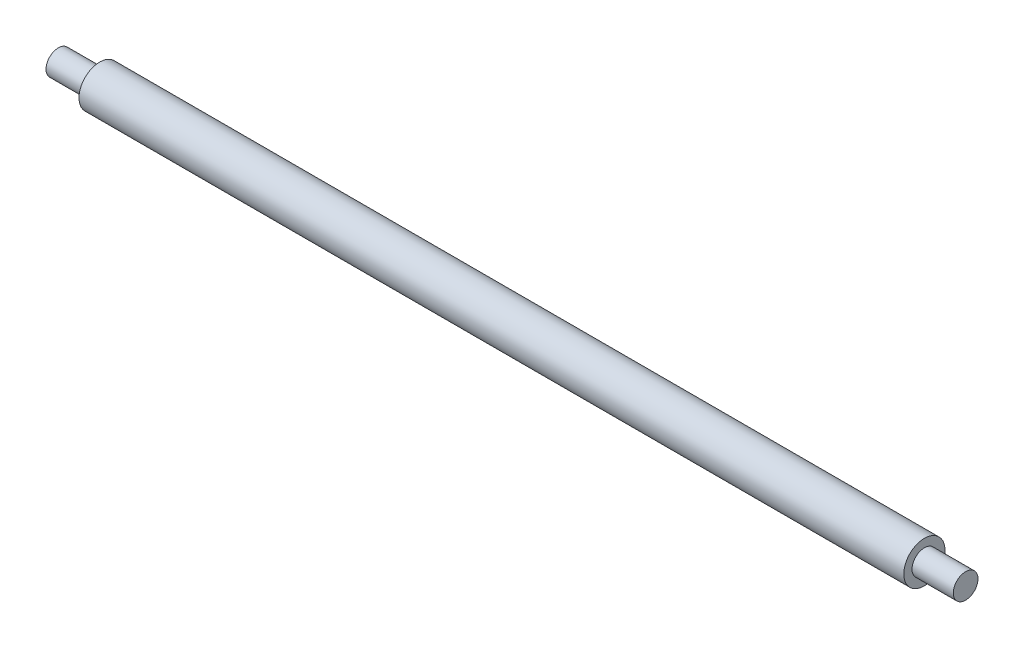
ISO-10303-21;
HEADER;
FILE_DESCRIPTION(('STEP AP214'),'2;1');
FILE_NAME('part.step','',(''),(''),'','','');
FILE_SCHEMA(('AUTOMOTIVE_DESIGN { 1 0 10303 214 1 1 1 1 }'));
ENDSEC;
DATA;
#1=APPLICATION_CONTEXT('core data for automotive mechanical design processes');
#2=APPLICATION_PROTOCOL_DEFINITION('international standard','automotive_design',2000,#1);
#3=PRODUCT_CONTEXT('',#1,'mechanical');
#4=PRODUCT('Part','Part','',(#3));
#5=PRODUCT_RELATED_PRODUCT_CATEGORY('part','',(#4));
#6=PRODUCT_DEFINITION_FORMATION('','',#4);
#7=PRODUCT_DEFINITION_CONTEXT('part definition',#1,'design');
#8=PRODUCT_DEFINITION('design','',#6,#7);
#9=PRODUCT_DEFINITION_SHAPE('','',#8);
#10=(LENGTH_UNIT() NAMED_UNIT(*) SI_UNIT(.MILLI.,.METRE.));
#11=(NAMED_UNIT(*) PLANE_ANGLE_UNIT() SI_UNIT($,.RADIAN.));
#12=(NAMED_UNIT(*) SI_UNIT($,.STERADIAN.) SOLID_ANGLE_UNIT());
#13=UNCERTAINTY_MEASURE_WITH_UNIT(LENGTH_MEASURE(1.E-05),#10,'distance_accuracy_value','');
#14=(GEOMETRIC_REPRESENTATION_CONTEXT(3) GLOBAL_UNCERTAINTY_ASSIGNED_CONTEXT((#13)) GLOBAL_UNIT_ASSIGNED_CONTEXT((#10,
#11,#12)) REPRESENTATION_CONTEXT('',''));
#15=CARTESIAN_POINT('',(0.,0.,0.));
#16=DIRECTION('',(0.,0.,1.));
#17=DIRECTION('',(1.,0.,0.));
#18=AXIS2_PLACEMENT_3D('',#15,#16,#17);
#19=CARTESIAN_POINT('',(220.,0.,0.));
#20=DIRECTION('',(-1.,0.,0.));
#21=DIRECTION('',(0.,0.,1.));
#22=AXIS2_PLACEMENT_3D('',#19,#20,#21);
#23=CYLINDRICAL_SURFACE('',#22,5.);
#24=CARTESIAN_POINT('',(10.,0.,0.));
#25=DIRECTION('',(-1.,0.,0.));
#26=DIRECTION('',(0.,0.,1.));
#27=AXIS2_PLACEMENT_3D('',#24,#25,#26);
#28=CIRCLE('',#27,5.);
#29=CARTESIAN_POINT('',(10.,0.,5.));
#30=VERTEX_POINT('',#29);
#31=EDGE_CURVE('E11',#30,#30,#28,.T.);
#32=ORIENTED_EDGE('',*,*,#31,.F.);
#33=EDGE_LOOP('',(#32));
#34=FACE_BOUND('',#33,.T.);
#35=CARTESIAN_POINT('',(210.,0.,0.));
#36=DIRECTION('',(1.,0.,0.));
#37=DIRECTION('',(0.,0.,-1.));
#38=AXIS2_PLACEMENT_3D('',#35,#36,#37);
#39=CIRCLE('',#38,5.);
#40=CARTESIAN_POINT('',(210.,0.,-5.));
#41=VERTEX_POINT('',#40);
#42=EDGE_CURVE('E39',#41,#41,#39,.T.);
#43=ORIENTED_EDGE('',*,*,#42,.F.);
#44=EDGE_LOOP('',(#43));
#45=FACE_BOUND('',#44,.T.);
#46=ADVANCED_FACE('F36',(#34,#45),#23,.T.);
#47=CARTESIAN_POINT('',(10.,0.,0.));
#48=DIRECTION('',(-1.,0.,0.));
#49=DIRECTION('',(0.,0.,1.));
#50=AXIS2_PLACEMENT_3D('',#47,#48,#49);
#51=PLANE('',#50);
#52=CARTESIAN_POINT('',(10.,0.,0.));
#53=DIRECTION('',(-1.,0.,0.));
#54=DIRECTION('',(0.,0.,1.));
#55=AXIS2_PLACEMENT_3D('',#52,#53,#54);
#56=CIRCLE('',#55,3.);
#57=CARTESIAN_POINT('',(10.,0.,3.));
#58=VERTEX_POINT('',#57);
#59=EDGE_CURVE('E43',#58,#58,#56,.T.);
#60=ORIENTED_EDGE('',*,*,#59,.F.);
#61=EDGE_LOOP('',(#60));
#62=FACE_BOUND('',#61,.T.);
#63=ORIENTED_EDGE('',*,*,#31,.T.);
#64=EDGE_LOOP('',(#63));
#65=FACE_BOUND('',#64,.T.);
#66=ADVANCED_FACE('F65',(#62,#65),#51,.T.);
#67=CARTESIAN_POINT('',(10.,0.,0.));
#68=DIRECTION('',(-1.,0.,0.));
#69=DIRECTION('',(0.,0.,1.));
#70=AXIS2_PLACEMENT_3D('',#67,#68,#69);
#71=CYLINDRICAL_SURFACE('',#70,3.);
#72=ORIENTED_EDGE('',*,*,#59,.T.);
#73=EDGE_LOOP('',(#72));
#74=FACE_BOUND('',#73,.T.);
#75=CARTESIAN_POINT('',(0.,0.,0.));
#76=DIRECTION('',(-1.,0.,0.));
#77=DIRECTION('',(0.,0.,1.));
#78=AXIS2_PLACEMENT_3D('',#75,#76,#77);
#79=CIRCLE('',#78,3.);
#80=CARTESIAN_POINT('',(0.,0.,3.));
#81=VERTEX_POINT('',#80);
#82=EDGE_CURVE('E47',#81,#81,#79,.T.);
#83=ORIENTED_EDGE('',*,*,#82,.F.);
#84=EDGE_LOOP('',(#83));
#85=FACE_BOUND('',#84,.T.);
#86=ADVANCED_FACE('F70',(#74,#85),#71,.T.);
#87=CARTESIAN_POINT('',(0.,0.,0.));
#88=DIRECTION('',(1.,0.,0.));
#89=DIRECTION('',(0.,0.,-1.));
#90=AXIS2_PLACEMENT_3D('',#87,#88,#89);
#91=PLANE('',#90);
#92=ORIENTED_EDGE('',*,*,#82,.T.);
#93=EDGE_LOOP('',(#92));
#94=FACE_BOUND('',#93,.T.);
#95=ADVANCED_FACE('F76',(#94),#91,.F.);
#96=CARTESIAN_POINT('',(210.,0.,0.));
#97=DIRECTION('',(1.,0.,0.));
#98=DIRECTION('',(0.,0.,-1.));
#99=AXIS2_PLACEMENT_3D('',#96,#97,#98);
#100=PLANE('',#99);
#101=CARTESIAN_POINT('',(210.,0.,0.));
#102=DIRECTION('',(1.,0.,0.));
#103=DIRECTION('',(0.,0.,-1.));
#104=AXIS2_PLACEMENT_3D('',#101,#102,#103);
#105=CIRCLE('',#104,3.);
#106=CARTESIAN_POINT('',(210.,0.,-3.));
#107=VERTEX_POINT('',#106);
#108=EDGE_CURVE('E55',#107,#107,#105,.T.);
#109=ORIENTED_EDGE('',*,*,#108,.F.);
#110=EDGE_LOOP('',(#109));
#111=FACE_BOUND('',#110,.T.);
#112=ORIENTED_EDGE('',*,*,#42,.T.);
#113=EDGE_LOOP('',(#112));
#114=FACE_BOUND('',#113,.T.);
#115=ADVANCED_FACE('F62',(#111,#114),#100,.T.);
#116=CARTESIAN_POINT('',(210.,0.,0.));
#117=DIRECTION('',(1.,0.,0.));
#118=DIRECTION('',(0.,0.,-1.));
#119=AXIS2_PLACEMENT_3D('',#116,#117,#118);
#120=CYLINDRICAL_SURFACE('',#119,3.);
#121=ORIENTED_EDGE('',*,*,#108,.T.);
#122=EDGE_LOOP('',(#121));
#123=FACE_BOUND('',#122,.T.);
#124=CARTESIAN_POINT('',(220.,0.,0.));
#125=DIRECTION('',(1.,0.,0.));
#126=DIRECTION('',(0.,0.,-1.));
#127=AXIS2_PLACEMENT_3D('',#124,#125,#126);
#128=CIRCLE('',#127,3.);
#129=CARTESIAN_POINT('',(220.,0.,-3.));
#130=VERTEX_POINT('',#129);
#131=EDGE_CURVE('E52',#130,#130,#128,.T.);
#132=ORIENTED_EDGE('',*,*,#131,.F.);
#133=EDGE_LOOP('',(#132));
#134=FACE_BOUND('',#133,.T.);
#135=ADVANCED_FACE('F84',(#123,#134),#120,.T.);
#136=CARTESIAN_POINT('',(220.,0.,0.));
#137=DIRECTION('',(1.,0.,0.));
#138=DIRECTION('',(0.,0.,-1.));
#139=AXIS2_PLACEMENT_3D('',#136,#137,#138);
#140=PLANE('',#139);
#141=ORIENTED_EDGE('',*,*,#131,.T.);
#142=EDGE_LOOP('',(#141));
#143=FACE_BOUND('',#142,.T.);
#144=ADVANCED_FACE('F82',(#143),#140,.T.);
#145=CLOSED_SHELL('',(#46,#66,#86,#95,#115,#135,#144));
#146=MANIFOLD_SOLID_BREP('B2',#145);
#147=ADVANCED_BREP_SHAPE_REPRESENTATION('',(#18,#146),#14);
#148=SHAPE_DEFINITION_REPRESENTATION(#9,#147);
ENDSEC;
END-ISO-10303-21;
